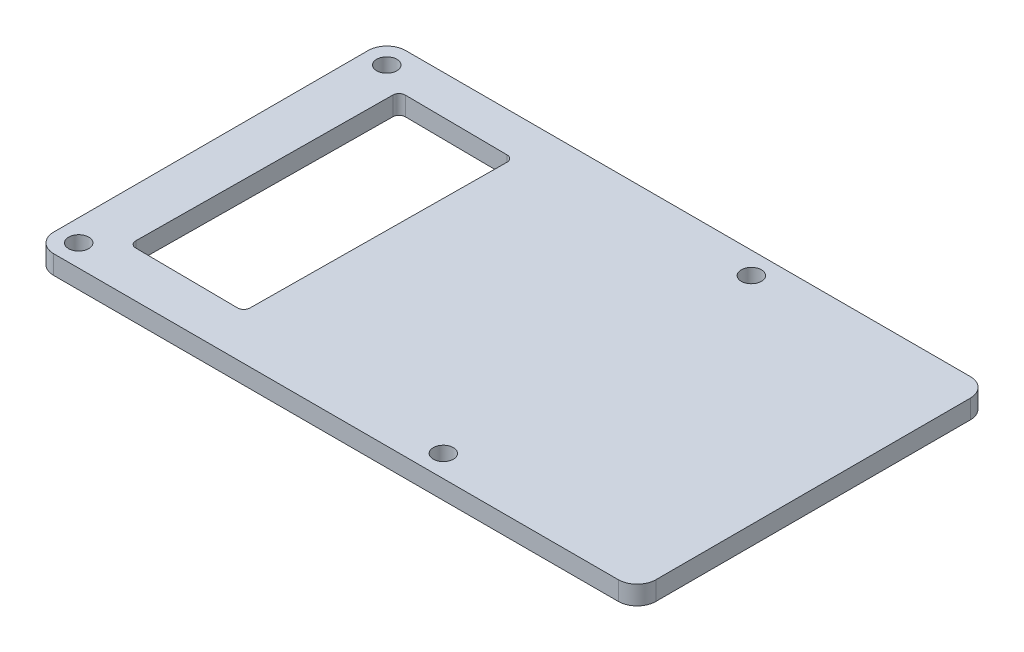
ISO-10303-21;
HEADER;
FILE_DESCRIPTION(('STEP AP214'),'2;1');
FILE_NAME('part.step','',(''),(''),'','','');
FILE_SCHEMA(('AUTOMOTIVE_DESIGN { 1 0 10303 214 1 1 1 1 }'));
ENDSEC;
DATA;
#1=APPLICATION_CONTEXT('core data for automotive mechanical design processes');
#2=APPLICATION_PROTOCOL_DEFINITION('international standard','automotive_design',2000,#1);
#3=PRODUCT_CONTEXT('',#1,'mechanical');
#4=PRODUCT('Part','Part','',(#3));
#5=PRODUCT_RELATED_PRODUCT_CATEGORY('part','',(#4));
#6=PRODUCT_DEFINITION_FORMATION('','',#4);
#7=PRODUCT_DEFINITION_CONTEXT('part definition',#1,'design');
#8=PRODUCT_DEFINITION('design','',#6,#7);
#9=PRODUCT_DEFINITION_SHAPE('','',#8);
#10=(LENGTH_UNIT() NAMED_UNIT(*) SI_UNIT(.MILLI.,.METRE.));
#11=(NAMED_UNIT(*) PLANE_ANGLE_UNIT() SI_UNIT($,.RADIAN.));
#12=(NAMED_UNIT(*) SI_UNIT($,.STERADIAN.) SOLID_ANGLE_UNIT());
#13=UNCERTAINTY_MEASURE_WITH_UNIT(LENGTH_MEASURE(1.E-05),#10,'distance_accuracy_value','');
#14=(GEOMETRIC_REPRESENTATION_CONTEXT(3) GLOBAL_UNCERTAINTY_ASSIGNED_CONTEXT((#13)) GLOBAL_UNIT_ASSIGNED_CONTEXT((#10,
#11,#12)) REPRESENTATION_CONTEXT('',''));
#15=CARTESIAN_POINT('',(0.,0.,0.));
#16=DIRECTION('',(0.,0.,1.));
#17=DIRECTION('',(1.,0.,0.));
#18=AXIS2_PLACEMENT_3D('',#15,#16,#17);
#19=CARTESIAN_POINT('',(-77.0217231267692,3.,-21.4026703774337));
#20=DIRECTION('',(0.,1.,0.));
#21=DIRECTION('',(0.,0.,1.));
#22=AXIS2_PLACEMENT_3D('',#19,#20,#21);
#23=PLANE('',#22);
#24=CARTESIAN_POINT('',(-18.5283322199872,3.,28.1136567752183));
#25=DIRECTION('',(0.,1.,0.));
#26=DIRECTION('',(0.,0.,1.));
#27=AXIS2_PLACEMENT_3D('',#24,#25,#26);
#28=CIRCLE('',#27,1.6);
#29=CARTESIAN_POINT('',(-18.5283322199872,3.,29.7136567752183));
#30=VERTEX_POINT('',#29);
#31=EDGE_CURVE('E223',#30,#30,#28,.T.);
#32=ORIENTED_EDGE('',*,*,#31,.F.);
#33=EDGE_LOOP('',(#32));
#34=FACE_BOUND('',#33,.T.);
#35=CARTESIAN_POINT('',(-76.5284846202892,3.,-20.8867242255417));
#36=DIRECTION('',(0.,1.,0.));
#37=DIRECTION('',(0.,0.,1.));
#38=AXIS2_PLACEMENT_3D('',#35,#36,#37);
#39=CIRCLE('',#38,1.6);
#40=CARTESIAN_POINT('',(-76.5284846202892,3.,-19.2867242255417));
#41=VERTEX_POINT('',#40);
#42=EDGE_CURVE('E235',#41,#41,#39,.T.);
#43=ORIENTED_EDGE('',*,*,#42,.F.);
#44=EDGE_LOOP('',(#43));
#45=FACE_BOUND('',#44,.T.);
#46=CARTESIAN_POINT('',(-77.0217231267692,3.,-21.4026703774337));
#47=DIRECTION('',(0.,1.,0.));
#48=DIRECTION('',(0.,0.,1.));
#49=AXIS2_PLACEMENT_3D('',#46,#47,#48);
#50=CIRCLE('',#49,2.98730505461);
#51=CARTESIAN_POINT('',(-77.0217231267692,3.,-24.3899754320437));
#52=VERTEX_POINT('',#51);
#53=CARTESIAN_POINT('',(-80.0090281813792,3.,-21.4026703774337));
#54=VERTEX_POINT('',#53);
#55=EDGE_CURVE('E241',#52,#54,#50,.T.);
#56=ORIENTED_EDGE('',*,*,#55,.T.);
#57=DIRECTION('',(0.,0.,1.));
#58=VECTOR('',#57,1.);
#59=CARTESIAN_POINT('',(-80.0090281813792,3.,-21.4026703774337));
#60=LINE('',#59,#58);
#61=CARTESIAN_POINT('',(-80.0090281813792,3.,28.6044314767683));
#62=VERTEX_POINT('',#61);
#63=EDGE_CURVE('E244',#54,#62,#60,.T.);
#64=ORIENTED_EDGE('',*,*,#63,.T.);
#65=CARTESIAN_POINT('',(-77.0217231267692,3.,28.6044314767683));
#66=DIRECTION('',(0.,1.,0.));
#67=DIRECTION('',(0.,0.,1.));
#68=AXIS2_PLACEMENT_3D('',#65,#66,#67);
#69=CIRCLE('',#68,2.98730505460999);
#70=CARTESIAN_POINT('',(-77.0217231267692,3.,31.5917365313783));
#71=VERTEX_POINT('',#70);
#72=EDGE_CURVE('E247',#62,#71,#69,.T.);
#73=ORIENTED_EDGE('',*,*,#72,.T.);
#74=DIRECTION('',(1.,0.,0.));
#75=VECTOR('',#74,1.);
#76=CARTESIAN_POINT('',(-77.0217231267692,3.,31.5917365313783));
#77=LINE('',#76,#75);
#78=CARTESIAN_POINT('',(12.7872583311938,3.,31.5917365313783));
#79=VERTEX_POINT('',#78);
#80=EDGE_CURVE('E249',#71,#79,#77,.T.);
#81=ORIENTED_EDGE('',*,*,#80,.T.);
#82=CARTESIAN_POINT('',(12.7872583311938,3.,28.6044314767683));
#83=DIRECTION('',(0.,1.,0.));
#84=DIRECTION('',(0.,0.,1.));
#85=AXIS2_PLACEMENT_3D('',#82,#83,#84);
#86=CIRCLE('',#85,2.98730505461);
#87=CARTESIAN_POINT('',(15.7745633858038,3.,28.6044314767683));
#88=VERTEX_POINT('',#87);
#89=EDGE_CURVE('E251',#79,#88,#86,.T.);
#90=ORIENTED_EDGE('',*,*,#89,.T.);
#91=DIRECTION('',(0.,0.,-1.));
#92=VECTOR('',#91,1.);
#93=CARTESIAN_POINT('',(15.7745633858038,3.,28.6044314767683));
#94=LINE('',#93,#92);
#95=CARTESIAN_POINT('',(15.7745633858038,3.,-21.4026703774337));
#96=VERTEX_POINT('',#95);
#97=EDGE_CURVE('E253',#88,#96,#94,.T.);
#98=ORIENTED_EDGE('',*,*,#97,.T.);
#99=CARTESIAN_POINT('',(12.7872583311938,3.,-21.4026703774337));
#100=DIRECTION('',(0.,1.,0.));
#101=DIRECTION('',(0.,0.,1.));
#102=AXIS2_PLACEMENT_3D('',#99,#100,#101);
#103=CIRCLE('',#102,2.98730505461001);
#104=CARTESIAN_POINT('',(12.7872583311938,3.,-24.3899754320437));
#105=VERTEX_POINT('',#104);
#106=EDGE_CURVE('E255',#96,#105,#103,.T.);
#107=ORIENTED_EDGE('',*,*,#106,.T.);
#108=DIRECTION('',(-1.,0.,0.));
#109=VECTOR('',#108,1.);
#110=CARTESIAN_POINT('',(12.7872583311938,3.,-24.3899754320437));
#111=LINE('',#110,#109);
#112=EDGE_CURVE('E257',#105,#52,#111,.T.);
#113=ORIENTED_EDGE('',*,*,#112,.T.);
#114=EDGE_LOOP('',(#56,#64,#73,#81,#90,#98,#107,#113));
#115=FACE_BOUND('',#114,.T.);
#116=CARTESIAN_POINT('',(-18.5285862204952,3.,-20.8865972252877));
#117=DIRECTION('',(0.,1.,0.));
#118=DIRECTION('',(0.,0.,1.));
#119=AXIS2_PLACEMENT_3D('',#116,#117,#118);
#120=CIRCLE('',#119,1.6);
#121=CARTESIAN_POINT('',(-18.5285862204952,3.,-19.2865972252877));
#122=VERTEX_POINT('',#121);
#123=EDGE_CURVE('E229',#122,#122,#120,.T.);
#124=ORIENTED_EDGE('',*,*,#123,.F.);
#125=EDGE_LOOP('',(#124));
#126=FACE_BOUND('',#125,.T.);
#127=CARTESIAN_POINT('',(-76.5283322199792,3.,28.1135297749583));
#128=DIRECTION('',(0.,1.,0.));
#129=DIRECTION('',(0.,0.,1.));
#130=AXIS2_PLACEMENT_3D('',#127,#128,#129);
#131=CIRCLE('',#130,1.6);
#132=CARTESIAN_POINT('',(-76.5283322199792,3.,29.7135297749583));
#133=VERTEX_POINT('',#132);
#134=EDGE_CURVE('E217',#133,#133,#131,.T.);
#135=ORIENTED_EDGE('',*,*,#134,.F.);
#136=EDGE_LOOP('',(#135));
#137=FACE_BOUND('',#136,.T.);
#138=DIRECTION('',(0.999958987348962,0.,0.00905668924269613));
#139=VECTOR('',#138,1.);
#140=CARTESIAN_POINT('',(-54.9495846601127,3.,24.4364048241797));
#141=LINE('',#140,#139);
#142=CARTESIAN_POINT('',(-71.2884962041201,3.,24.2884223106065));
#143=VERTEX_POINT('',#142);
#144=CARTESIAN_POINT('',(-54.9495846601127,3.,24.4364048241797));
#145=VERTEX_POINT('',#144);
#146=EDGE_CURVE('E160',#143,#145,#141,.T.);
#147=ORIENTED_EDGE('',*,*,#146,.F.);
#148=CARTESIAN_POINT('',(-71.2794395148774,3.,23.2884633232575));
#149=DIRECTION('',(0.,1.,0.));
#150=DIRECTION('',(0.,0.,-1.));
#151=AXIS2_PLACEMENT_3D('',#148,#149,#150);
#152=CIRCLE('',#151,1.);
#153=CARTESIAN_POINT('',(-72.2793985022264,3.,23.2794066340148));
#154=VERTEX_POINT('',#153);
#155=EDGE_CURVE('E152',#154,#143,#152,.T.);
#156=ORIENTED_EDGE('',*,*,#155,.F.);
#157=DIRECTION('',(-0.00905668924269614,0.,0.999958987348962));
#158=VECTOR('',#157,1.);
#159=CARTESIAN_POINT('',(-71.9124173860874,3.,-17.2393806884538));
#160=LINE('',#159,#158);
#161=CARTESIAN_POINT('',(-71.9124173860874,3.,-17.2393806884538));
#162=VERTEX_POINT('',#161);
#163=EDGE_CURVE('E185',#162,#154,#160,.T.);
#164=ORIENTED_EDGE('',*,*,#163,.F.);
#165=CARTESIAN_POINT('',(-70.9124583987385,3.,-17.2303239992111));
#166=DIRECTION('',(0.,1.,0.));
#167=DIRECTION('',(0.,0.,1.));
#168=AXIS2_PLACEMENT_3D('',#165,#166,#167);
#169=CIRCLE('',#168,1.);
#170=CARTESIAN_POINT('',(-70.9034017094957,3.,-18.2302829865601));
#171=VERTEX_POINT('',#170);
#172=EDGE_CURVE('E183',#171,#162,#169,.T.);
#173=ORIENTED_EDGE('',*,*,#172,.F.);
#174=DIRECTION('',(-0.999958987348962,0.,-0.00905668924269613));
#175=VECTOR('',#174,1.);
#176=CARTESIAN_POINT('',(-70.9034017094957,3.,-18.2302829865601));
#177=LINE('',#176,#175);
#178=CARTESIAN_POINT('',(-54.5644901654883,3.,-18.0823004729869));
#179=VERTEX_POINT('',#178);
#180=EDGE_CURVE('E181',#179,#171,#177,.T.);
#181=ORIENTED_EDGE('',*,*,#180,.F.);
#182=CARTESIAN_POINT('',(-54.573546854731,3.,-17.0823414856379));
#183=DIRECTION('',(0.,1.,0.));
#184=DIRECTION('',(0.,0.,1.));
#185=AXIS2_PLACEMENT_3D('',#182,#183,#184);
#186=CIRCLE('',#185,1.);
#187=CARTESIAN_POINT('',(-53.5735878673821,3.,-17.0732847963952));
#188=VERTEX_POINT('',#187);
#189=EDGE_CURVE('E179',#188,#179,#186,.T.);
#190=ORIENTED_EDGE('',*,*,#189,.F.);
#191=DIRECTION('',(0.00905668924269597,0.,-0.999958987348962));
#192=VECTOR('',#191,1.);
#193=CARTESIAN_POINT('',(-53.5735878673821,3.,-17.0732847963952));
#194=LINE('',#193,#192);
#195=CARTESIAN_POINT('',(-53.940568983521,3.,23.4455025260734));
#196=VERTEX_POINT('',#195);
#197=EDGE_CURVE('E175',#196,#188,#194,.T.);
#198=ORIENTED_EDGE('',*,*,#197,.F.);
#199=CARTESIAN_POINT('',(-54.94052797087,3.,23.4364458368307));
#200=DIRECTION('',(0.,1.,0.));
#201=DIRECTION('',(0.,0.,-1.));
#202=AXIS2_PLACEMENT_3D('',#199,#200,#201);
#203=CIRCLE('',#202,1.);
#204=EDGE_CURVE('E173',#145,#196,#203,.T.);
#205=ORIENTED_EDGE('',*,*,#204,.F.);
#206=EDGE_LOOP('',(#147,#156,#164,#173,#181,#190,#198,#205));
#207=FACE_BOUND('',#206,.T.);
#208=ADVANCED_FACE('F39',(#34,#45,#115,#126,#137,#207),#23,.T.);
#209=CARTESIAN_POINT('',(-77.0217231267692,0.,-21.4026703774337));
#210=DIRECTION('',(0.,1.,0.));
#211=DIRECTION('',(0.,0.,1.));
#212=AXIS2_PLACEMENT_3D('',#209,#210,#211);
#213=PLANE('',#212);
#214=CARTESIAN_POINT('',(-76.5283322199792,0.,28.1135297749583));
#215=DIRECTION('',(0.,1.,0.));
#216=DIRECTION('',(0.,0.,1.));
#217=AXIS2_PLACEMENT_3D('',#214,#215,#216);
#218=CIRCLE('',#217,1.6);
#219=CARTESIAN_POINT('',(-76.5283322199792,0.,29.7135297749583));
#220=VERTEX_POINT('',#219);
#221=EDGE_CURVE('E168',#220,#220,#218,.T.);
#222=ORIENTED_EDGE('',*,*,#221,.T.);
#223=EDGE_LOOP('',(#222));
#224=FACE_BOUND('',#223,.T.);
#225=CARTESIAN_POINT('',(-18.5283322199872,0.,28.1136567752183));
#226=DIRECTION('',(0.,1.,0.));
#227=DIRECTION('',(0.,0.,1.));
#228=AXIS2_PLACEMENT_3D('',#225,#226,#227);
#229=CIRCLE('',#228,1.6);
#230=CARTESIAN_POINT('',(-18.5283322199872,0.,29.7136567752183));
#231=VERTEX_POINT('',#230);
#232=EDGE_CURVE('E220',#231,#231,#229,.T.);
#233=ORIENTED_EDGE('',*,*,#232,.T.);
#234=EDGE_LOOP('',(#233));
#235=FACE_BOUND('',#234,.T.);
#236=CARTESIAN_POINT('',(-18.5285862204952,0.,-20.8865972252877));
#237=DIRECTION('',(0.,1.,0.));
#238=DIRECTION('',(0.,0.,1.));
#239=AXIS2_PLACEMENT_3D('',#236,#237,#238);
#240=CIRCLE('',#239,1.6);
#241=CARTESIAN_POINT('',(-18.5285862204952,0.,-19.2865972252877));
#242=VERTEX_POINT('',#241);
#243=EDGE_CURVE('E226',#242,#242,#240,.T.);
#244=ORIENTED_EDGE('',*,*,#243,.T.);
#245=EDGE_LOOP('',(#244));
#246=FACE_BOUND('',#245,.T.);
#247=CARTESIAN_POINT('',(-76.5284846202892,0.,-20.8867242255417));
#248=DIRECTION('',(0.,1.,0.));
#249=DIRECTION('',(0.,0.,1.));
#250=AXIS2_PLACEMENT_3D('',#247,#248,#249);
#251=CIRCLE('',#250,1.6);
#252=CARTESIAN_POINT('',(-76.5284846202892,0.,-19.2867242255417));
#253=VERTEX_POINT('',#252);
#254=EDGE_CURVE('E232',#253,#253,#251,.T.);
#255=ORIENTED_EDGE('',*,*,#254,.T.);
#256=EDGE_LOOP('',(#255));
#257=FACE_BOUND('',#256,.T.);
#258=CARTESIAN_POINT('',(-77.0217231267692,0.,-21.4026703774337));
#259=DIRECTION('',(0.,1.,0.));
#260=DIRECTION('',(0.,0.,1.));
#261=AXIS2_PLACEMENT_3D('',#258,#259,#260);
#262=CIRCLE('',#261,2.98730505461);
#263=CARTESIAN_POINT('',(-77.0217231267692,0.,-24.3899754320437));
#264=VERTEX_POINT('',#263);
#265=CARTESIAN_POINT('',(-80.0090281813792,0.,-21.4026703774337));
#266=VERTEX_POINT('',#265);
#267=EDGE_CURVE('E238',#264,#266,#262,.T.);
#268=ORIENTED_EDGE('',*,*,#267,.F.);
#269=DIRECTION('',(-1.,0.,0.));
#270=VECTOR('',#269,1.);
#271=CARTESIAN_POINT('',(12.7872583311938,0.,-24.3899754320437));
#272=LINE('',#271,#270);
#273=CARTESIAN_POINT('',(12.7872583311938,0.,-24.3899754320437));
#274=VERTEX_POINT('',#273);
#275=EDGE_CURVE('E245',#274,#264,#272,.T.);
#276=ORIENTED_EDGE('',*,*,#275,.F.);
#277=CARTESIAN_POINT('',(12.7872583311938,0.,-21.4026703774337));
#278=DIRECTION('',(0.,1.,0.));
#279=DIRECTION('',(0.,0.,1.));
#280=AXIS2_PLACEMENT_3D('',#277,#278,#279);
#281=CIRCLE('',#280,2.98730505461001);
#282=CARTESIAN_POINT('',(15.7745633858038,0.,-21.4026703774337));
#283=VERTEX_POINT('',#282);
#284=EDGE_CURVE('E272',#283,#274,#281,.T.);
#285=ORIENTED_EDGE('',*,*,#284,.F.);
#286=DIRECTION('',(0.,0.,-1.));
#287=VECTOR('',#286,1.);
#288=CARTESIAN_POINT('',(15.7745633858038,0.,28.6044314767683));
#289=LINE('',#288,#287);
#290=CARTESIAN_POINT('',(15.7745633858038,0.,28.6044314767683));
#291=VERTEX_POINT('',#290);
#292=EDGE_CURVE('E270',#291,#283,#289,.T.);
#293=ORIENTED_EDGE('',*,*,#292,.F.);
#294=CARTESIAN_POINT('',(12.7872583311938,0.,28.6044314767683));
#295=DIRECTION('',(0.,1.,0.));
#296=DIRECTION('',(0.,0.,1.));
#297=AXIS2_PLACEMENT_3D('',#294,#295,#296);
#298=CIRCLE('',#297,2.98730505461);
#299=CARTESIAN_POINT('',(12.7872583311938,0.,31.5917365313783));
#300=VERTEX_POINT('',#299);
#301=EDGE_CURVE('E268',#300,#291,#298,.T.);
#302=ORIENTED_EDGE('',*,*,#301,.F.);
#303=DIRECTION('',(1.,0.,0.));
#304=VECTOR('',#303,1.);
#305=CARTESIAN_POINT('',(-77.0217231267692,0.,31.5917365313783));
#306=LINE('',#305,#304);
#307=CARTESIAN_POINT('',(-77.0217231267692,0.,31.5917365313783));
#308=VERTEX_POINT('',#307);
#309=EDGE_CURVE('E266',#308,#300,#306,.T.);
#310=ORIENTED_EDGE('',*,*,#309,.F.);
#311=CARTESIAN_POINT('',(-77.0217231267692,0.,28.6044314767683));
#312=DIRECTION('',(0.,1.,0.));
#313=DIRECTION('',(0.,0.,1.));
#314=AXIS2_PLACEMENT_3D('',#311,#312,#313);
#315=CIRCLE('',#314,2.98730505460999);
#316=CARTESIAN_POINT('',(-80.0090281813792,0.,28.6044314767683));
#317=VERTEX_POINT('',#316);
#318=EDGE_CURVE('E264',#317,#308,#315,.T.);
#319=ORIENTED_EDGE('',*,*,#318,.F.);
#320=DIRECTION('',(0.,0.,1.));
#321=VECTOR('',#320,1.);
#322=CARTESIAN_POINT('',(-80.0090281813792,0.,-21.4026703774337));
#323=LINE('',#322,#321);
#324=EDGE_CURVE('E262',#266,#317,#323,.T.);
#325=ORIENTED_EDGE('',*,*,#324,.F.);
#326=EDGE_LOOP('',(#268,#276,#285,#293,#302,#310,#319,#325));
#327=FACE_BOUND('',#326,.T.);
#328=CARTESIAN_POINT('',(-71.2794395148774,0.,23.2884633232575));
#329=DIRECTION('',(0.,1.,0.));
#330=DIRECTION('',(0.,0.,-1.));
#331=AXIS2_PLACEMENT_3D('',#328,#329,#330);
#332=CIRCLE('',#331,1.);
#333=CARTESIAN_POINT('',(-72.2793985022264,0.,23.2794066340148));
#334=VERTEX_POINT('',#333);
#335=CARTESIAN_POINT('',(-71.2884962041201,0.,24.2884223106065));
#336=VERTEX_POINT('',#335);
#337=EDGE_CURVE('E62',#334,#336,#332,.T.);
#338=ORIENTED_EDGE('',*,*,#337,.T.);
#339=DIRECTION('',(0.999958987348962,0.,0.00905668924269613));
#340=VECTOR('',#339,1.);
#341=CARTESIAN_POINT('',(-54.9495846601127,0.,24.4364048241797));
#342=LINE('',#341,#340);
#343=CARTESIAN_POINT('',(-54.9495846601127,0.,24.4364048241797));
#344=VERTEX_POINT('',#343);
#345=EDGE_CURVE('E167',#336,#344,#342,.T.);
#346=ORIENTED_EDGE('',*,*,#345,.T.);
#347=CARTESIAN_POINT('',(-54.94052797087,0.,23.4364458368307));
#348=DIRECTION('',(0.,1.,0.));
#349=DIRECTION('',(0.,0.,-1.));
#350=AXIS2_PLACEMENT_3D('',#347,#348,#349);
#351=CIRCLE('',#350,1.);
#352=CARTESIAN_POINT('',(-53.940568983521,0.,23.4455025260734));
#353=VERTEX_POINT('',#352);
#354=EDGE_CURVE('E189',#344,#353,#351,.T.);
#355=ORIENTED_EDGE('',*,*,#354,.T.);
#356=DIRECTION('',(0.00905668924269597,0.,-0.999958987348962));
#357=VECTOR('',#356,1.);
#358=CARTESIAN_POINT('',(-53.5735878673821,0.,-17.0732847963952));
#359=LINE('',#358,#357);
#360=CARTESIAN_POINT('',(-53.5735878673821,0.,-17.0732847963952));
#361=VERTEX_POINT('',#360);
#362=EDGE_CURVE('E192',#353,#361,#359,.T.);
#363=ORIENTED_EDGE('',*,*,#362,.T.);
#364=CARTESIAN_POINT('',(-54.573546854731,0.,-17.0823414856379));
#365=DIRECTION('',(0.,1.,0.));
#366=DIRECTION('',(0.,0.,1.));
#367=AXIS2_PLACEMENT_3D('',#364,#365,#366);
#368=CIRCLE('',#367,1.);
#369=CARTESIAN_POINT('',(-54.5644901654883,0.,-18.0823004729869));
#370=VERTEX_POINT('',#369);
#371=EDGE_CURVE('E195',#361,#370,#368,.T.);
#372=ORIENTED_EDGE('',*,*,#371,.T.);
#373=DIRECTION('',(-0.999958987348962,0.,-0.00905668924269613));
#374=VECTOR('',#373,1.);
#375=CARTESIAN_POINT('',(-70.9034017094957,0.,-18.2302829865601));
#376=LINE('',#375,#374);
#377=CARTESIAN_POINT('',(-70.9034017094957,0.,-18.2302829865601));
#378=VERTEX_POINT('',#377);
#379=EDGE_CURVE('E198',#370,#378,#376,.T.);
#380=ORIENTED_EDGE('',*,*,#379,.T.);
#381=CARTESIAN_POINT('',(-70.9124583987385,0.,-17.2303239992111));
#382=DIRECTION('',(0.,1.,0.));
#383=DIRECTION('',(0.,0.,1.));
#384=AXIS2_PLACEMENT_3D('',#381,#382,#383);
#385=CIRCLE('',#384,1.);
#386=CARTESIAN_POINT('',(-71.9124173860874,0.,-17.2393806884538));
#387=VERTEX_POINT('',#386);
#388=EDGE_CURVE('E201',#378,#387,#385,.T.);
#389=ORIENTED_EDGE('',*,*,#388,.T.);
#390=DIRECTION('',(-0.00905668924269614,0.,0.999958987348962));
#391=VECTOR('',#390,1.);
#392=CARTESIAN_POINT('',(-71.9124173860874,0.,-17.2393806884538));
#393=LINE('',#392,#391);
#394=EDGE_CURVE('E161',#387,#334,#393,.T.);
#395=ORIENTED_EDGE('',*,*,#394,.T.);
#396=EDGE_LOOP('',(#338,#346,#355,#363,#372,#380,#389,#395));
#397=FACE_BOUND('',#396,.T.);
#398=ADVANCED_FACE('F302',(#224,#235,#246,#257,#327,#397),#213,.F.);
#399=CARTESIAN_POINT('',(-77.0217231267692,3.,-21.4026703774337));
#400=DIRECTION('',(0.,-1.,0.));
#401=DIRECTION('',(0.,0.,-1.));
#402=AXIS2_PLACEMENT_3D('',#399,#400,#401);
#403=CYLINDRICAL_SURFACE('',#402,2.98730505461);
#404=ORIENTED_EDGE('',*,*,#267,.T.);
#405=DIRECTION('',(0.,-1.,0.));
#406=VECTOR('',#405,1.);
#407=CARTESIAN_POINT('',(-80.0090281813792,3.,-21.4026703774337));
#408=LINE('',#407,#406);
#409=EDGE_CURVE('E11',#54,#266,#408,.T.);
#410=ORIENTED_EDGE('',*,*,#409,.F.);
#411=ORIENTED_EDGE('',*,*,#55,.F.);
#412=DIRECTION('',(0.,-1.,0.));
#413=VECTOR('',#412,1.);
#414=CARTESIAN_POINT('',(-77.0217231267692,3.,-24.3899754320437));
#415=LINE('',#414,#413);
#416=EDGE_CURVE('E259',#52,#264,#415,.T.);
#417=ORIENTED_EDGE('',*,*,#416,.T.);
#418=EDGE_LOOP('',(#404,#410,#411,#417));
#419=FACE_BOUND('',#418,.T.);
#420=ADVANCED_FACE('F41',(#419),#403,.T.);
#421=CARTESIAN_POINT('',(-80.0090281813792,3.,-21.4026703774337));
#422=DIRECTION('',(1.,0.,0.));
#423=DIRECTION('',(0.,0.,-1.));
#424=AXIS2_PLACEMENT_3D('',#421,#422,#423);
#425=PLANE('',#424);
#426=ORIENTED_EDGE('',*,*,#324,.T.);
#427=DIRECTION('',(0.,-1.,0.));
#428=VECTOR('',#427,1.);
#429=CARTESIAN_POINT('',(-80.0090281813792,3.,28.6044314767683));
#430=LINE('',#429,#428);
#431=EDGE_CURVE('E47',#62,#317,#430,.T.);
#432=ORIENTED_EDGE('',*,*,#431,.F.);
#433=ORIENTED_EDGE('',*,*,#63,.F.);
#434=ORIENTED_EDGE('',*,*,#409,.T.);
#435=EDGE_LOOP('',(#426,#432,#433,#434));
#436=FACE_BOUND('',#435,.T.);
#437=ADVANCED_FACE('F320',(#436),#425,.F.);
#438=CARTESIAN_POINT('',(-77.0217231267692,3.,28.6044314767683));
#439=DIRECTION('',(0.,-1.,0.));
#440=DIRECTION('',(0.,0.,-1.));
#441=AXIS2_PLACEMENT_3D('',#438,#439,#440);
#442=CYLINDRICAL_SURFACE('',#441,2.98730505460999);
#443=ORIENTED_EDGE('',*,*,#318,.T.);
#444=DIRECTION('',(0.,-1.,0.));
#445=VECTOR('',#444,1.);
#446=CARTESIAN_POINT('',(-77.0217231267692,3.,31.5917365313783));
#447=LINE('',#446,#445);
#448=EDGE_CURVE('E289',#71,#308,#447,.T.);
#449=ORIENTED_EDGE('',*,*,#448,.F.);
#450=ORIENTED_EDGE('',*,*,#72,.F.);
#451=ORIENTED_EDGE('',*,*,#431,.T.);
#452=EDGE_LOOP('',(#443,#449,#450,#451));
#453=FACE_BOUND('',#452,.T.);
#454=ADVANCED_FACE('F296',(#453),#442,.T.);
#455=CARTESIAN_POINT('',(-77.0217231267692,3.,31.5917365313783));
#456=DIRECTION('',(0.,0.,-1.));
#457=DIRECTION('',(-1.,0.,0.));
#458=AXIS2_PLACEMENT_3D('',#455,#456,#457);
#459=PLANE('',#458);
#460=ORIENTED_EDGE('',*,*,#309,.T.);
#461=DIRECTION('',(0.,-1.,0.));
#462=VECTOR('',#461,1.);
#463=CARTESIAN_POINT('',(12.7872583311938,3.,31.5917365313783));
#464=LINE('',#463,#462);
#465=EDGE_CURVE('E286',#79,#300,#464,.T.);
#466=ORIENTED_EDGE('',*,*,#465,.F.);
#467=ORIENTED_EDGE('',*,*,#80,.F.);
#468=ORIENTED_EDGE('',*,*,#448,.T.);
#469=EDGE_LOOP('',(#460,#466,#467,#468));
#470=FACE_BOUND('',#469,.T.);
#471=ADVANCED_FACE('F308',(#470),#459,.F.);
#472=CARTESIAN_POINT('',(12.7872583311938,3.,28.6044314767683));
#473=DIRECTION('',(0.,-1.,0.));
#474=DIRECTION('',(0.,0.,-1.));
#475=AXIS2_PLACEMENT_3D('',#472,#473,#474);
#476=CYLINDRICAL_SURFACE('',#475,2.98730505461);
#477=ORIENTED_EDGE('',*,*,#301,.T.);
#478=DIRECTION('',(0.,-1.,0.));
#479=VECTOR('',#478,1.);
#480=CARTESIAN_POINT('',(15.7745633858038,3.,28.6044314767683));
#481=LINE('',#480,#479);
#482=EDGE_CURVE('E283',#88,#291,#481,.T.);
#483=ORIENTED_EDGE('',*,*,#482,.F.);
#484=ORIENTED_EDGE('',*,*,#89,.F.);
#485=ORIENTED_EDGE('',*,*,#465,.T.);
#486=EDGE_LOOP('',(#477,#483,#484,#485));
#487=FACE_BOUND('',#486,.T.);
#488=ADVANCED_FACE('F312',(#487),#476,.T.);
#489=CARTESIAN_POINT('',(15.7745633858038,3.,28.6044314767683));
#490=DIRECTION('',(-1.,0.,0.));
#491=DIRECTION('',(0.,0.,1.));
#492=AXIS2_PLACEMENT_3D('',#489,#490,#491);
#493=PLANE('',#492);
#494=ORIENTED_EDGE('',*,*,#292,.T.);
#495=DIRECTION('',(0.,-1.,0.));
#496=VECTOR('',#495,1.);
#497=CARTESIAN_POINT('',(15.7745633858038,3.,-21.4026703774337));
#498=LINE('',#497,#496);
#499=EDGE_CURVE('E280',#96,#283,#498,.T.);
#500=ORIENTED_EDGE('',*,*,#499,.F.);
#501=ORIENTED_EDGE('',*,*,#97,.F.);
#502=ORIENTED_EDGE('',*,*,#482,.T.);
#503=EDGE_LOOP('',(#494,#500,#501,#502));
#504=FACE_BOUND('',#503,.T.);
#505=ADVANCED_FACE('F333',(#504),#493,.F.);
#506=CARTESIAN_POINT('',(12.7872583311938,3.,-21.4026703774337));
#507=DIRECTION('',(0.,-1.,0.));
#508=DIRECTION('',(0.,0.,-1.));
#509=AXIS2_PLACEMENT_3D('',#506,#507,#508);
#510=CYLINDRICAL_SURFACE('',#509,2.98730505461001);
#511=ORIENTED_EDGE('',*,*,#284,.T.);
#512=DIRECTION('',(0.,-1.,0.));
#513=VECTOR('',#512,1.);
#514=CARTESIAN_POINT('',(12.7872583311938,3.,-24.3899754320437));
#515=LINE('',#514,#513);
#516=EDGE_CURVE('E277',#105,#274,#515,.T.);
#517=ORIENTED_EDGE('',*,*,#516,.F.);
#518=ORIENTED_EDGE('',*,*,#106,.F.);
#519=ORIENTED_EDGE('',*,*,#499,.T.);
#520=EDGE_LOOP('',(#511,#517,#518,#519));
#521=FACE_BOUND('',#520,.T.);
#522=ADVANCED_FACE('F331',(#521),#510,.T.);
#523=CARTESIAN_POINT('',(12.7872583311938,3.,-24.3899754320437));
#524=DIRECTION('',(0.,0.,1.));
#525=DIRECTION('',(1.,0.,0.));
#526=AXIS2_PLACEMENT_3D('',#523,#524,#525);
#527=PLANE('',#526);
#528=ORIENTED_EDGE('',*,*,#275,.T.);
#529=ORIENTED_EDGE('',*,*,#416,.F.);
#530=ORIENTED_EDGE('',*,*,#112,.F.);
#531=ORIENTED_EDGE('',*,*,#516,.T.);
#532=EDGE_LOOP('',(#528,#529,#530,#531));
#533=FACE_BOUND('',#532,.T.);
#534=ADVANCED_FACE('F326',(#533),#527,.F.);
#535=CARTESIAN_POINT('',(-76.5284846202892,3.,-20.8867242255417));
#536=DIRECTION('',(0.,-1.,0.));
#537=DIRECTION('',(0.,0.,-1.));
#538=AXIS2_PLACEMENT_3D('',#535,#536,#537);
#539=CYLINDRICAL_SURFACE('',#538,1.6);
#540=ORIENTED_EDGE('',*,*,#42,.T.);
#541=EDGE_LOOP('',(#540));
#542=FACE_BOUND('',#541,.T.);
#543=ORIENTED_EDGE('',*,*,#254,.F.);
#544=EDGE_LOOP('',(#543));
#545=FACE_BOUND('',#544,.T.);
#546=ADVANCED_FACE('F353',(#542,#545),#539,.F.);
#547=CARTESIAN_POINT('',(-18.5285862204952,3.,-20.8865972252877));
#548=DIRECTION('',(0.,-1.,0.));
#549=DIRECTION('',(0.,0.,-1.));
#550=AXIS2_PLACEMENT_3D('',#547,#548,#549);
#551=CYLINDRICAL_SURFACE('',#550,1.6);
#552=ORIENTED_EDGE('',*,*,#123,.T.);
#553=EDGE_LOOP('',(#552));
#554=FACE_BOUND('',#553,.T.);
#555=ORIENTED_EDGE('',*,*,#243,.F.);
#556=EDGE_LOOP('',(#555));
#557=FACE_BOUND('',#556,.T.);
#558=ADVANCED_FACE('F360',(#554,#557),#551,.F.);
#559=CARTESIAN_POINT('',(-18.5283322199872,3.,28.1136567752183));
#560=DIRECTION('',(0.,-1.,0.));
#561=DIRECTION('',(0.,0.,-1.));
#562=AXIS2_PLACEMENT_3D('',#559,#560,#561);
#563=CYLINDRICAL_SURFACE('',#562,1.6);
#564=ORIENTED_EDGE('',*,*,#31,.T.);
#565=EDGE_LOOP('',(#564));
#566=FACE_BOUND('',#565,.T.);
#567=ORIENTED_EDGE('',*,*,#232,.F.);
#568=EDGE_LOOP('',(#567));
#569=FACE_BOUND('',#568,.T.);
#570=ADVANCED_FACE('F365',(#566,#569),#563,.F.);
#571=CARTESIAN_POINT('',(-76.5283322199792,3.,28.1135297749583));
#572=DIRECTION('',(0.,-1.,0.));
#573=DIRECTION('',(0.,0.,-1.));
#574=AXIS2_PLACEMENT_3D('',#571,#572,#573);
#575=CYLINDRICAL_SURFACE('',#574,1.6);
#576=ORIENTED_EDGE('',*,*,#134,.T.);
#577=EDGE_LOOP('',(#576));
#578=FACE_BOUND('',#577,.T.);
#579=ORIENTED_EDGE('',*,*,#221,.F.);
#580=EDGE_LOOP('',(#579));
#581=FACE_BOUND('',#580,.T.);
#582=ADVANCED_FACE('F374',(#578,#581),#575,.F.);
#583=CARTESIAN_POINT('',(-71.2794395148774,3.,23.2884633232575));
#584=DIRECTION('',(0.,-1.,0.));
#585=DIRECTION('',(0.,0.,-1.));
#586=AXIS2_PLACEMENT_3D('',#583,#584,#585);
#587=CYLINDRICAL_SURFACE('',#586,1.);
#588=ORIENTED_EDGE('',*,*,#337,.F.);
#589=DIRECTION('',(0.,-1.,0.));
#590=VECTOR('',#589,1.);
#591=CARTESIAN_POINT('',(-72.2793985022264,3.,23.2794066340148));
#592=LINE('',#591,#590);
#593=EDGE_CURVE('E156',#154,#334,#592,.T.);
#594=ORIENTED_EDGE('',*,*,#593,.F.);
#595=ORIENTED_EDGE('',*,*,#155,.T.);
#596=DIRECTION('',(0.,-1.,0.));
#597=VECTOR('',#596,1.);
#598=CARTESIAN_POINT('',(-71.2884962041201,3.,24.2884223106065));
#599=LINE('',#598,#597);
#600=EDGE_CURVE('E155',#143,#336,#599,.T.);
#601=ORIENTED_EDGE('',*,*,#600,.T.);
#602=EDGE_LOOP('',(#588,#594,#595,#601));
#603=FACE_BOUND('',#602,.T.);
#604=ADVANCED_FACE('F154',(#603),#587,.F.);
#605=CARTESIAN_POINT('',(-54.9495846601127,3.,24.4364048241797));
#606=DIRECTION('',(0.00905668924269612,0.,-0.999958987348962));
#607=DIRECTION('',(-0.999958987348962,0.,-0.00905668924269613));
#608=AXIS2_PLACEMENT_3D('',#605,#606,#607);
#609=PLANE('',#608);
#610=ORIENTED_EDGE('',*,*,#345,.F.);
#611=ORIENTED_EDGE('',*,*,#600,.F.);
#612=ORIENTED_EDGE('',*,*,#146,.T.);
#613=DIRECTION('',(0.,-1.,0.));
#614=VECTOR('',#613,1.);
#615=CARTESIAN_POINT('',(-54.9495846601127,3.,24.4364048241797));
#616=LINE('',#615,#614);
#617=EDGE_CURVE('E169',#145,#344,#616,.T.);
#618=ORIENTED_EDGE('',*,*,#617,.T.);
#619=EDGE_LOOP('',(#610,#611,#612,#618));
#620=FACE_BOUND('',#619,.T.);
#621=ADVANCED_FACE('F164',(#620),#609,.T.);
#622=CARTESIAN_POINT('',(-54.94052797087,3.,23.4364458368307));
#623=DIRECTION('',(0.,-1.,0.));
#624=DIRECTION('',(0.,0.,-1.));
#625=AXIS2_PLACEMENT_3D('',#622,#623,#624);
#626=CYLINDRICAL_SURFACE('',#625,1.);
#627=ORIENTED_EDGE('',*,*,#354,.F.);
#628=ORIENTED_EDGE('',*,*,#617,.F.);
#629=ORIENTED_EDGE('',*,*,#204,.T.);
#630=DIRECTION('',(0.,-1.,0.));
#631=VECTOR('',#630,1.);
#632=CARTESIAN_POINT('',(-53.940568983521,3.,23.4455025260734));
#633=LINE('',#632,#631);
#634=EDGE_CURVE('E214',#196,#353,#633,.T.);
#635=ORIENTED_EDGE('',*,*,#634,.T.);
#636=EDGE_LOOP('',(#627,#628,#629,#635));
#637=FACE_BOUND('',#636,.T.);
#638=ADVANCED_FACE('F386',(#637),#626,.F.);
#639=CARTESIAN_POINT('',(-53.5735878673821,3.,-17.0732847963952));
#640=DIRECTION('',(-0.999958987348962,0.,-0.00905668924269597));
#641=DIRECTION('',(-0.00905668924269597,0.,0.999958987348962));
#642=AXIS2_PLACEMENT_3D('',#639,#640,#641);
#643=PLANE('',#642);
#644=ORIENTED_EDGE('',*,*,#362,.F.);
#645=ORIENTED_EDGE('',*,*,#634,.F.);
#646=ORIENTED_EDGE('',*,*,#197,.T.);
#647=DIRECTION('',(0.,-1.,0.));
#648=VECTOR('',#647,1.);
#649=CARTESIAN_POINT('',(-53.5735878673821,3.,-17.0732847963952));
#650=LINE('',#649,#648);
#651=EDGE_CURVE('E212',#188,#361,#650,.T.);
#652=ORIENTED_EDGE('',*,*,#651,.T.);
#653=EDGE_LOOP('',(#644,#645,#646,#652));
#654=FACE_BOUND('',#653,.T.);
#655=ADVANCED_FACE('F389',(#654),#643,.T.);
#656=CARTESIAN_POINT('',(-54.573546854731,3.,-17.0823414856379));
#657=DIRECTION('',(0.,-1.,0.));
#658=DIRECTION('',(0.,0.,-1.));
#659=AXIS2_PLACEMENT_3D('',#656,#657,#658);
#660=CYLINDRICAL_SURFACE('',#659,1.);
#661=ORIENTED_EDGE('',*,*,#371,.F.);
#662=ORIENTED_EDGE('',*,*,#651,.F.);
#663=ORIENTED_EDGE('',*,*,#189,.T.);
#664=DIRECTION('',(0.,-1.,0.));
#665=VECTOR('',#664,1.);
#666=CARTESIAN_POINT('',(-54.5644901654883,3.,-18.0823004729869));
#667=LINE('',#666,#665);
#668=EDGE_CURVE('E210',#179,#370,#667,.T.);
#669=ORIENTED_EDGE('',*,*,#668,.T.);
#670=EDGE_LOOP('',(#661,#662,#663,#669));
#671=FACE_BOUND('',#670,.T.);
#672=ADVANCED_FACE('F393',(#671),#660,.F.);
#673=CARTESIAN_POINT('',(-70.9034017094957,3.,-18.2302829865601));
#674=DIRECTION('',(-0.00905668924269613,0.,0.999958987348962));
#675=DIRECTION('',(0.999958987348962,0.,0.00905668924269613));
#676=AXIS2_PLACEMENT_3D('',#673,#674,#675);
#677=PLANE('',#676);
#678=ORIENTED_EDGE('',*,*,#379,.F.);
#679=ORIENTED_EDGE('',*,*,#668,.F.);
#680=ORIENTED_EDGE('',*,*,#180,.T.);
#681=DIRECTION('',(0.,-1.,0.));
#682=VECTOR('',#681,1.);
#683=CARTESIAN_POINT('',(-70.9034017094957,3.,-18.2302829865601));
#684=LINE('',#683,#682);
#685=EDGE_CURVE('E208',#171,#378,#684,.T.);
#686=ORIENTED_EDGE('',*,*,#685,.T.);
#687=EDGE_LOOP('',(#678,#679,#680,#686));
#688=FACE_BOUND('',#687,.T.);
#689=ADVANCED_FACE('F397',(#688),#677,.T.);
#690=CARTESIAN_POINT('',(-70.9124583987385,3.,-17.2303239992111));
#691=DIRECTION('',(0.,-1.,0.));
#692=DIRECTION('',(0.,0.,-1.));
#693=AXIS2_PLACEMENT_3D('',#690,#691,#692);
#694=CYLINDRICAL_SURFACE('',#693,1.);
#695=ORIENTED_EDGE('',*,*,#388,.F.);
#696=ORIENTED_EDGE('',*,*,#685,.F.);
#697=ORIENTED_EDGE('',*,*,#172,.T.);
#698=DIRECTION('',(0.,-1.,0.));
#699=VECTOR('',#698,1.);
#700=CARTESIAN_POINT('',(-71.9124173860874,3.,-17.2393806884538));
#701=LINE('',#700,#699);
#702=EDGE_CURVE('E54',#162,#387,#701,.T.);
#703=ORIENTED_EDGE('',*,*,#702,.T.);
#704=EDGE_LOOP('',(#695,#696,#697,#703));
#705=FACE_BOUND('',#704,.T.);
#706=ADVANCED_FACE('F401',(#705),#694,.F.);
#707=CARTESIAN_POINT('',(-71.9124173860874,3.,-17.2393806884538));
#708=DIRECTION('',(0.999958987348962,0.,0.00905668924269614));
#709=DIRECTION('',(0.00905668924269614,0.,-0.999958987348962));
#710=AXIS2_PLACEMENT_3D('',#707,#708,#709);
#711=PLANE('',#710);
#712=ORIENTED_EDGE('',*,*,#394,.F.);
#713=ORIENTED_EDGE('',*,*,#702,.F.);
#714=ORIENTED_EDGE('',*,*,#163,.T.);
#715=ORIENTED_EDGE('',*,*,#593,.T.);
#716=EDGE_LOOP('',(#712,#713,#714,#715));
#717=FACE_BOUND('',#716,.T.);
#718=ADVANCED_FACE('F405',(#717),#711,.T.);
#719=CLOSED_SHELL('',(#208,#398,#420,#437,#454,#471,#488,#505,#522,#534,#546,#558,#570,#582,
#604,#621,#638,#655,#672,#689,#706,#718));
#720=MANIFOLD_SOLID_BREP('B2',#719);
#721=ADVANCED_BREP_SHAPE_REPRESENTATION('',(#18,#720),#14);
#722=SHAPE_DEFINITION_REPRESENTATION(#9,#721);
ENDSEC;
END-ISO-10303-21;
